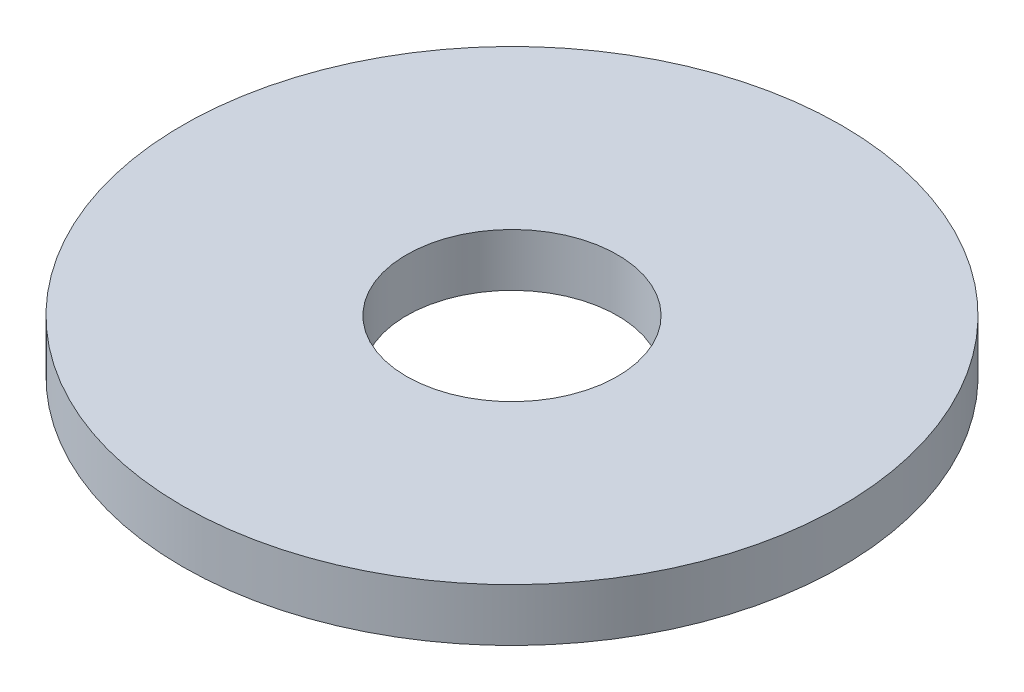
ISO-10303-21;
HEADER;
FILE_DESCRIPTION(('STEP AP214'),'2;1');
FILE_NAME('part.step','',(''),(''),'','','');
FILE_SCHEMA(('AUTOMOTIVE_DESIGN { 1 0 10303 214 1 1 1 1 }'));
ENDSEC;
DATA;
#1=APPLICATION_CONTEXT('core data for automotive mechanical design processes');
#2=APPLICATION_PROTOCOL_DEFINITION('international standard','automotive_design',2000,#1);
#3=PRODUCT_CONTEXT('',#1,'mechanical');
#4=PRODUCT('Part','Part','',(#3));
#5=PRODUCT_RELATED_PRODUCT_CATEGORY('part','',(#4));
#6=PRODUCT_DEFINITION_FORMATION('','',#4);
#7=PRODUCT_DEFINITION_CONTEXT('part definition',#1,'design');
#8=PRODUCT_DEFINITION('design','',#6,#7);
#9=PRODUCT_DEFINITION_SHAPE('','',#8);
#10=(LENGTH_UNIT() NAMED_UNIT(*) SI_UNIT(.MILLI.,.METRE.));
#11=(NAMED_UNIT(*) PLANE_ANGLE_UNIT() SI_UNIT($,.RADIAN.));
#12=(NAMED_UNIT(*) SI_UNIT($,.STERADIAN.) SOLID_ANGLE_UNIT());
#13=UNCERTAINTY_MEASURE_WITH_UNIT(LENGTH_MEASURE(1.E-05),#10,'distance_accuracy_value','');
#14=(GEOMETRIC_REPRESENTATION_CONTEXT(3) GLOBAL_UNCERTAINTY_ASSIGNED_CONTEXT((#13)) GLOBAL_UNIT_ASSIGNED_CONTEXT((#10,
#11,#12)) REPRESENTATION_CONTEXT('',''));
#15=CARTESIAN_POINT('',(0.,0.,0.));
#16=DIRECTION('',(0.,0.,1.));
#17=DIRECTION('',(1.,0.,0.));
#18=AXIS2_PLACEMENT_3D('',#15,#16,#17);
#19=CARTESIAN_POINT('',(0.,0.4,0.));
#20=DIRECTION('',(0.,1.,0.));
#21=DIRECTION('',(0.,0.,1.));
#22=AXIS2_PLACEMENT_3D('',#19,#20,#21);
#23=PLANE('',#22);
#24=CARTESIAN_POINT('',(0.,0.4,0.));
#25=DIRECTION('',(0.,1.,0.));
#26=DIRECTION('',(0.,0.,1.));
#27=AXIS2_PLACEMENT_3D('',#24,#25,#26);
#28=CIRCLE('',#27,5.);
#29=CARTESIAN_POINT('',(0.,0.4,5.));
#30=VERTEX_POINT('',#29);
#31=EDGE_CURVE('E10',#30,#30,#28,.T.);
#32=ORIENTED_EDGE('',*,*,#31,.T.);
#33=EDGE_LOOP('',(#32));
#34=FACE_BOUND('',#33,.T.);
#35=CARTESIAN_POINT('',(0.,0.4,0.));
#36=DIRECTION('',(0.,1.,0.));
#37=DIRECTION('',(0.,0.,1.));
#38=AXIS2_PLACEMENT_3D('',#35,#36,#37);
#39=CIRCLE('',#38,1.6);
#40=CARTESIAN_POINT('',(0.,0.4,1.6));
#41=VERTEX_POINT('',#40);
#42=EDGE_CURVE('E50',#41,#41,#39,.T.);
#43=ORIENTED_EDGE('',*,*,#42,.F.);
#44=EDGE_LOOP('',(#43));
#45=FACE_BOUND('',#44,.T.);
#46=ADVANCED_FACE('F39',(#34,#45),#23,.T.);
#47=CARTESIAN_POINT('',(0.,-0.4,0.));
#48=DIRECTION('',(0.,1.,0.));
#49=DIRECTION('',(0.,0.,1.));
#50=AXIS2_PLACEMENT_3D('',#47,#48,#49);
#51=PLANE('',#50);
#52=CARTESIAN_POINT('',(0.,-0.4,0.));
#53=DIRECTION('',(0.,1.,0.));
#54=DIRECTION('',(0.,0.,1.));
#55=AXIS2_PLACEMENT_3D('',#52,#53,#54);
#56=CIRCLE('',#55,5.);
#57=CARTESIAN_POINT('',(0.,-0.4,5.));
#58=VERTEX_POINT('',#57);
#59=EDGE_CURVE('E43',#58,#58,#56,.T.);
#60=ORIENTED_EDGE('',*,*,#59,.F.);
#61=EDGE_LOOP('',(#60));
#62=FACE_BOUND('',#61,.T.);
#63=CARTESIAN_POINT('',(0.,-0.4,0.));
#64=DIRECTION('',(0.,1.,0.));
#65=DIRECTION('',(0.,0.,1.));
#66=AXIS2_PLACEMENT_3D('',#63,#64,#65);
#67=CIRCLE('',#66,1.6);
#68=CARTESIAN_POINT('',(0.,-0.4,1.6));
#69=VERTEX_POINT('',#68);
#70=EDGE_CURVE('E52',#69,#69,#67,.T.);
#71=ORIENTED_EDGE('',*,*,#70,.T.);
#72=EDGE_LOOP('',(#71));
#73=FACE_BOUND('',#72,.T.);
#74=ADVANCED_FACE('F62',(#62,#73),#51,.F.);
#75=CARTESIAN_POINT('',(0.,0.4,0.));
#76=DIRECTION('',(0.,-1.,0.));
#77=DIRECTION('',(0.,0.,-1.));
#78=AXIS2_PLACEMENT_3D('',#75,#76,#77);
#79=CYLINDRICAL_SURFACE('',#78,5.);
#80=ORIENTED_EDGE('',*,*,#31,.F.);
#81=EDGE_LOOP('',(#80));
#82=FACE_BOUND('',#81,.T.);
#83=ORIENTED_EDGE('',*,*,#59,.T.);
#84=EDGE_LOOP('',(#83));
#85=FACE_BOUND('',#84,.T.);
#86=ADVANCED_FACE('F41',(#82,#85),#79,.T.);
#87=CARTESIAN_POINT('',(0.,0.4,0.));
#88=DIRECTION('',(0.,-1.,0.));
#89=DIRECTION('',(0.,0.,-1.));
#90=AXIS2_PLACEMENT_3D('',#87,#88,#89);
#91=CYLINDRICAL_SURFACE('',#90,1.6);
#92=ORIENTED_EDGE('',*,*,#42,.T.);
#93=EDGE_LOOP('',(#92));
#94=FACE_BOUND('',#93,.T.);
#95=ORIENTED_EDGE('',*,*,#70,.F.);
#96=EDGE_LOOP('',(#95));
#97=FACE_BOUND('',#96,.T.);
#98=ADVANCED_FACE('F58',(#94,#97),#91,.F.);
#99=CLOSED_SHELL('',(#46,#74,#86,#98));
#100=MANIFOLD_SOLID_BREP('B2',#99);
#101=ADVANCED_BREP_SHAPE_REPRESENTATION('',(#18,#100),#14);
#102=SHAPE_DEFINITION_REPRESENTATION(#9,#101);
ENDSEC;
END-ISO-10303-21;
